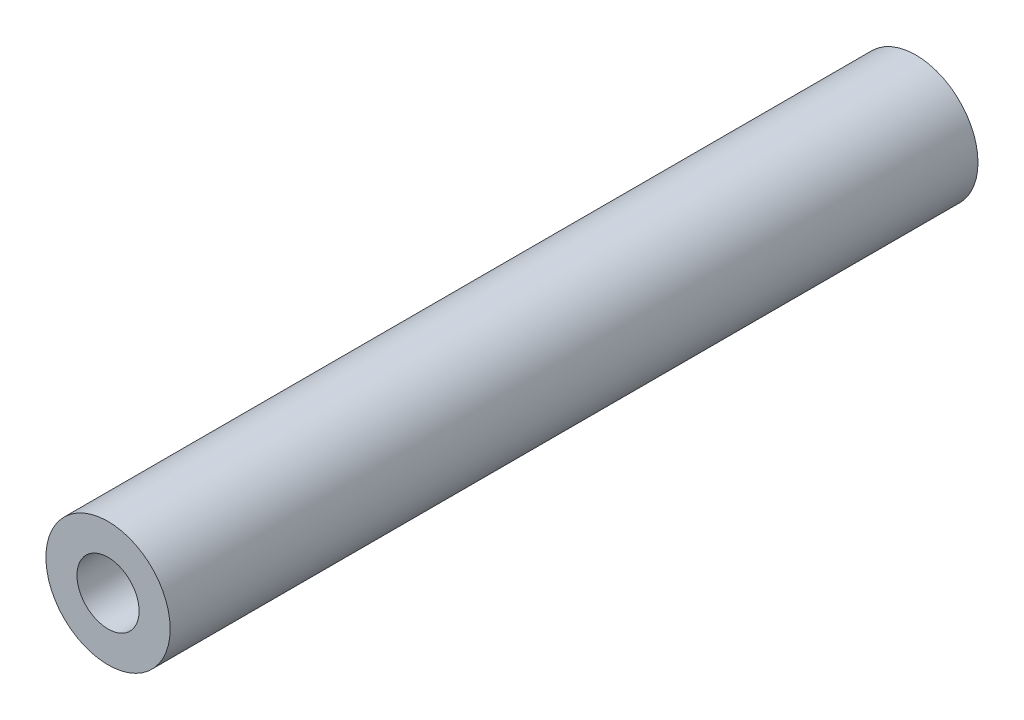
ISO-10303-21;
HEADER;
FILE_DESCRIPTION(('STEP AP214'),'2;1');
FILE_NAME('part.step','',(''),(''),'','','');
FILE_SCHEMA(('AUTOMOTIVE_DESIGN { 1 0 10303 214 1 1 1 1 }'));
ENDSEC;
DATA;
#1=APPLICATION_CONTEXT('core data for automotive mechanical design processes');
#2=APPLICATION_PROTOCOL_DEFINITION('international standard','automotive_design',2000,#1);
#3=PRODUCT_CONTEXT('',#1,'mechanical');
#4=PRODUCT('Part','Part','',(#3));
#5=PRODUCT_RELATED_PRODUCT_CATEGORY('part','',(#4));
#6=PRODUCT_DEFINITION_FORMATION('','',#4);
#7=PRODUCT_DEFINITION_CONTEXT('part definition',#1,'design');
#8=PRODUCT_DEFINITION('design','',#6,#7);
#9=PRODUCT_DEFINITION_SHAPE('','',#8);
#10=(LENGTH_UNIT() NAMED_UNIT(*) SI_UNIT(.MILLI.,.METRE.));
#11=(NAMED_UNIT(*) PLANE_ANGLE_UNIT() SI_UNIT($,.RADIAN.));
#12=(NAMED_UNIT(*) SI_UNIT($,.STERADIAN.) SOLID_ANGLE_UNIT());
#13=UNCERTAINTY_MEASURE_WITH_UNIT(LENGTH_MEASURE(1.E-05),#10,'distance_accuracy_value','');
#14=(GEOMETRIC_REPRESENTATION_CONTEXT(3) GLOBAL_UNCERTAINTY_ASSIGNED_CONTEXT((#13)) GLOBAL_UNIT_ASSIGNED_CONTEXT((#10,
#11,#12)) REPRESENTATION_CONTEXT('',''));
#15=CARTESIAN_POINT('',(0.,0.,0.));
#16=DIRECTION('',(0.,0.,1.));
#17=DIRECTION('',(1.,0.,0.));
#18=AXIS2_PLACEMENT_3D('',#15,#16,#17);
#19=CARTESIAN_POINT('',(0.,0.,65.));
#20=DIRECTION('',(0.,0.,1.));
#21=DIRECTION('',(1.,0.,0.));
#22=AXIS2_PLACEMENT_3D('',#19,#20,#21);
#23=PLANE('',#22);
#24=CARTESIAN_POINT('',(0.,0.,65.));
#25=DIRECTION('',(0.,0.,1.));
#26=DIRECTION('',(1.,0.,0.));
#27=AXIS2_PLACEMENT_3D('',#24,#25,#26);
#28=CIRCLE('',#27,5.);
#29=CARTESIAN_POINT('',(5.,0.,65.));
#30=VERTEX_POINT('',#29);
#31=EDGE_CURVE('E10',#30,#30,#28,.T.);
#32=ORIENTED_EDGE('',*,*,#31,.T.);
#33=EDGE_LOOP('',(#32));
#34=FACE_BOUND('',#33,.T.);
#35=CARTESIAN_POINT('',(0.,0.,65.));
#36=DIRECTION('',(0.,0.,1.));
#37=DIRECTION('',(1.,0.,0.));
#38=AXIS2_PLACEMENT_3D('',#35,#36,#37);
#39=CIRCLE('',#38,2.5);
#40=CARTESIAN_POINT('',(2.5,0.,65.));
#41=VERTEX_POINT('',#40);
#42=EDGE_CURVE('E42',#41,#41,#39,.T.);
#43=ORIENTED_EDGE('',*,*,#42,.F.);
#44=EDGE_LOOP('',(#43));
#45=FACE_BOUND('',#44,.T.);
#46=ADVANCED_FACE('F31',(#34,#45),#23,.T.);
#47=CARTESIAN_POINT('',(0.,0.,0.));
#48=DIRECTION('',(0.,0.,1.));
#49=DIRECTION('',(1.,0.,0.));
#50=AXIS2_PLACEMENT_3D('',#47,#48,#49);
#51=PLANE('',#50);
#52=CARTESIAN_POINT('',(0.,0.,0.));
#53=DIRECTION('',(0.,0.,1.));
#54=DIRECTION('',(1.,0.,0.));
#55=AXIS2_PLACEMENT_3D('',#52,#53,#54);
#56=CIRCLE('',#55,5.);
#57=CARTESIAN_POINT('',(5.,0.,0.));
#58=VERTEX_POINT('',#57);
#59=EDGE_CURVE('E35',#58,#58,#56,.T.);
#60=ORIENTED_EDGE('',*,*,#59,.F.);
#61=EDGE_LOOP('',(#60));
#62=FACE_BOUND('',#61,.T.);
#63=CARTESIAN_POINT('',(0.,0.,0.));
#64=DIRECTION('',(0.,0.,1.));
#65=DIRECTION('',(1.,0.,0.));
#66=AXIS2_PLACEMENT_3D('',#63,#64,#65);
#67=CIRCLE('',#66,2.5);
#68=CARTESIAN_POINT('',(2.5,0.,0.));
#69=VERTEX_POINT('',#68);
#70=EDGE_CURVE('E44',#69,#69,#67,.T.);
#71=ORIENTED_EDGE('',*,*,#70,.T.);
#72=EDGE_LOOP('',(#71));
#73=FACE_BOUND('',#72,.T.);
#74=ADVANCED_FACE('F54',(#62,#73),#51,.F.);
#75=CARTESIAN_POINT('',(0.,0.,65.));
#76=DIRECTION('',(0.,0.,-1.));
#77=DIRECTION('',(-1.,0.,0.));
#78=AXIS2_PLACEMENT_3D('',#75,#76,#77);
#79=CYLINDRICAL_SURFACE('',#78,5.);
#80=ORIENTED_EDGE('',*,*,#31,.F.);
#81=EDGE_LOOP('',(#80));
#82=FACE_BOUND('',#81,.T.);
#83=ORIENTED_EDGE('',*,*,#59,.T.);
#84=EDGE_LOOP('',(#83));
#85=FACE_BOUND('',#84,.T.);
#86=ADVANCED_FACE('F33',(#82,#85),#79,.T.);
#87=CARTESIAN_POINT('',(0.,0.,65.));
#88=DIRECTION('',(0.,0.,-1.));
#89=DIRECTION('',(-1.,0.,0.));
#90=AXIS2_PLACEMENT_3D('',#87,#88,#89);
#91=CYLINDRICAL_SURFACE('',#90,2.5);
#92=ORIENTED_EDGE('',*,*,#42,.T.);
#93=EDGE_LOOP('',(#92));
#94=FACE_BOUND('',#93,.T.);
#95=ORIENTED_EDGE('',*,*,#70,.F.);
#96=EDGE_LOOP('',(#95));
#97=FACE_BOUND('',#96,.T.);
#98=ADVANCED_FACE('F50',(#94,#97),#91,.F.);
#99=CLOSED_SHELL('',(#46,#74,#86,#98));
#100=MANIFOLD_SOLID_BREP('B2',#99);
#101=ADVANCED_BREP_SHAPE_REPRESENTATION('',(#18,#100),#14);
#102=SHAPE_DEFINITION_REPRESENTATION(#9,#101);
ENDSEC;
END-ISO-10303-21;
